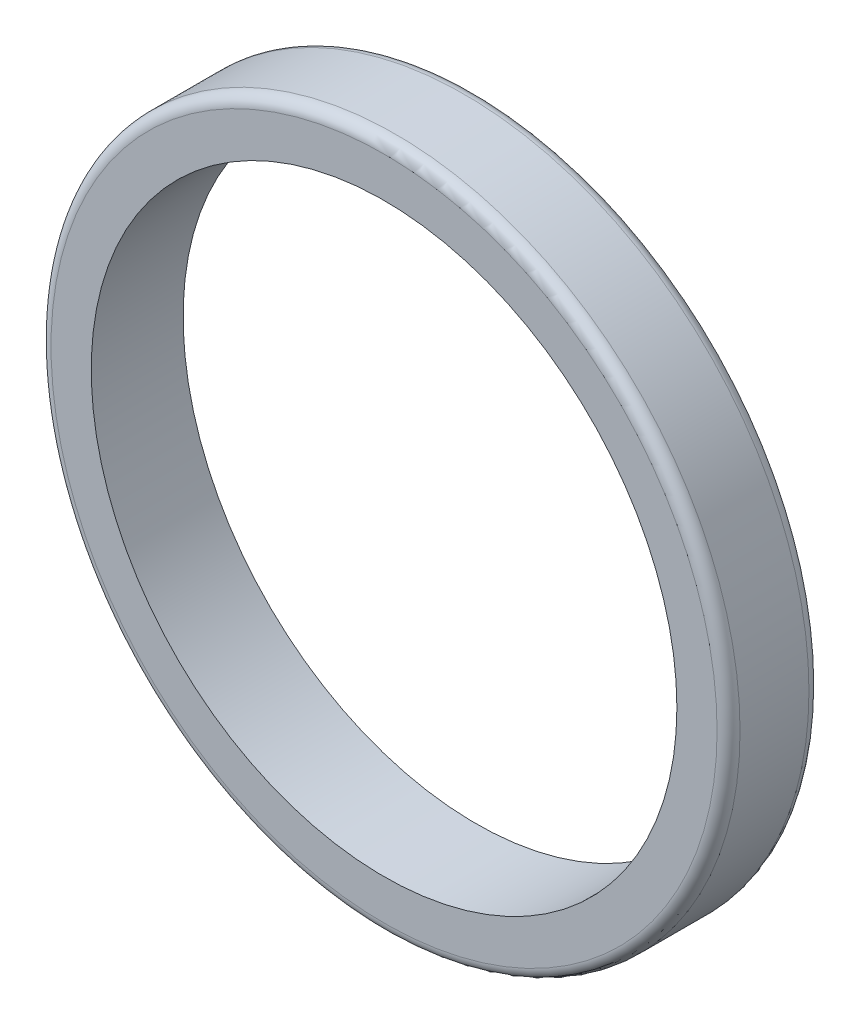
ISO-10303-21;
HEADER;
FILE_DESCRIPTION(('STEP AP214'),'2;1');
FILE_NAME('part.step','',(''),(''),'','','');
FILE_SCHEMA(('AUTOMOTIVE_DESIGN { 1 0 10303 214 1 1 1 1 }'));
ENDSEC;
DATA;
#1=APPLICATION_CONTEXT('core data for automotive mechanical design processes');
#2=APPLICATION_PROTOCOL_DEFINITION('international standard','automotive_design',2000,#1);
#3=PRODUCT_CONTEXT('',#1,'mechanical');
#4=PRODUCT('Part','Part','',(#3));
#5=PRODUCT_RELATED_PRODUCT_CATEGORY('part','',(#4));
#6=PRODUCT_DEFINITION_FORMATION('','',#4);
#7=PRODUCT_DEFINITION_CONTEXT('part definition',#1,'design');
#8=PRODUCT_DEFINITION('design','',#6,#7);
#9=PRODUCT_DEFINITION_SHAPE('','',#8);
#10=(LENGTH_UNIT() NAMED_UNIT(*) SI_UNIT(.MILLI.,.METRE.));
#11=(NAMED_UNIT(*) PLANE_ANGLE_UNIT() SI_UNIT($,.RADIAN.));
#12=(NAMED_UNIT(*) SI_UNIT($,.STERADIAN.) SOLID_ANGLE_UNIT());
#13=UNCERTAINTY_MEASURE_WITH_UNIT(LENGTH_MEASURE(1.E-05),#10,'distance_accuracy_value','');
#14=(GEOMETRIC_REPRESENTATION_CONTEXT(3) GLOBAL_UNCERTAINTY_ASSIGNED_CONTEXT((#13)) GLOBAL_UNIT_ASSIGNED_CONTEXT((#10,
#11,#12)) REPRESENTATION_CONTEXT('',''));
#15=CARTESIAN_POINT('',(0.,0.,0.));
#16=DIRECTION('',(0.,0.,1.));
#17=DIRECTION('',(1.,0.,0.));
#18=AXIS2_PLACEMENT_3D('',#15,#16,#17);
#19=CARTESIAN_POINT('',(0.,0.,8.));
#20=DIRECTION('',(0.,0.,-1.));
#21=DIRECTION('',(-1.,0.,0.));
#22=AXIS2_PLACEMENT_3D('',#19,#20,#21);
#23=CYLINDRICAL_SURFACE('',#22,30.);
#24=CARTESIAN_POINT('',(0.,0.,1.));
#25=DIRECTION('',(0.,0.,1.));
#26=DIRECTION('',(1.,0.,0.));
#27=AXIS2_PLACEMENT_3D('',#24,#25,#26);
#28=CIRCLE('',#27,30.);
#29=CARTESIAN_POINT('',(30.,0.,1.));
#30=VERTEX_POINT('',#29);
#31=EDGE_CURVE('E43',#30,#30,#28,.T.);
#32=ORIENTED_EDGE('',*,*,#31,.T.);
#33=EDGE_LOOP('',(#32));
#34=FACE_BOUND('',#33,.T.);
#35=CARTESIAN_POINT('',(0.,0.,7.));
#36=DIRECTION('',(0.,0.,1.));
#37=DIRECTION('',(1.,0.,0.));
#38=AXIS2_PLACEMENT_3D('',#35,#36,#37);
#39=CIRCLE('',#38,30.);
#40=CARTESIAN_POINT('',(30.,0.,7.));
#41=VERTEX_POINT('',#40);
#42=EDGE_CURVE('E47',#41,#41,#39,.F.);
#43=ORIENTED_EDGE('',*,*,#42,.T.);
#44=EDGE_LOOP('',(#43));
#45=FACE_BOUND('',#44,.T.);
#46=ADVANCED_FACE('F32',(#34,#45),#23,.T.);
#47=CARTESIAN_POINT('',(0.,0.,8.));
#48=DIRECTION('',(0.,0.,1.));
#49=DIRECTION('',(1.,0.,0.));
#50=AXIS2_PLACEMENT_3D('',#47,#48,#49);
#51=PLANE('',#50);
#52=CARTESIAN_POINT('',(0.,0.,8.));
#53=DIRECTION('',(0.,0.,1.));
#54=DIRECTION('',(1.,0.,0.));
#55=AXIS2_PLACEMENT_3D('',#52,#53,#54);
#56=CIRCLE('',#55,29.);
#57=CARTESIAN_POINT('',(29.,0.,8.));
#58=VERTEX_POINT('',#57);
#59=EDGE_CURVE('E10',#58,#58,#56,.T.);
#60=ORIENTED_EDGE('',*,*,#59,.T.);
#61=EDGE_LOOP('',(#60));
#62=FACE_BOUND('',#61,.T.);
#63=CARTESIAN_POINT('',(0.,0.,8.));
#64=DIRECTION('',(0.,0.,1.));
#65=DIRECTION('',(1.,0.,0.));
#66=AXIS2_PLACEMENT_3D('',#63,#64,#65);
#67=CIRCLE('',#66,25.5);
#68=CARTESIAN_POINT('',(25.5,0.,8.));
#69=VERTEX_POINT('',#68);
#70=EDGE_CURVE('E53',#69,#69,#67,.T.);
#71=ORIENTED_EDGE('',*,*,#70,.F.);
#72=EDGE_LOOP('',(#71));
#73=FACE_BOUND('',#72,.T.);
#74=ADVANCED_FACE('F68',(#62,#73),#51,.T.);
#75=CARTESIAN_POINT('',(0.,0.,0.));
#76=DIRECTION('',(0.,0.,1.));
#77=DIRECTION('',(1.,0.,0.));
#78=AXIS2_PLACEMENT_3D('',#75,#76,#77);
#79=PLANE('',#78);
#80=CARTESIAN_POINT('',(0.,0.,0.));
#81=DIRECTION('',(0.,0.,1.));
#82=DIRECTION('',(1.,0.,0.));
#83=AXIS2_PLACEMENT_3D('',#80,#81,#82);
#84=CIRCLE('',#83,29.);
#85=CARTESIAN_POINT('',(29.,0.,0.));
#86=VERTEX_POINT('',#85);
#87=EDGE_CURVE('E39',#86,#86,#84,.F.);
#88=ORIENTED_EDGE('',*,*,#87,.T.);
#89=EDGE_LOOP('',(#88));
#90=FACE_BOUND('',#89,.T.);
#91=CARTESIAN_POINT('',(0.,0.,0.));
#92=DIRECTION('',(0.,0.,1.));
#93=DIRECTION('',(1.,0.,0.));
#94=AXIS2_PLACEMENT_3D('',#91,#92,#93);
#95=CIRCLE('',#94,25.5);
#96=CARTESIAN_POINT('',(25.5,0.,0.));
#97=VERTEX_POINT('',#96);
#98=EDGE_CURVE('E52',#97,#97,#95,.T.);
#99=ORIENTED_EDGE('',*,*,#98,.T.);
#100=EDGE_LOOP('',(#99));
#101=FACE_BOUND('',#100,.T.);
#102=ADVANCED_FACE('F59',(#90,#101),#79,.F.);
#103=CARTESIAN_POINT('',(0.,0.,0.));
#104=DIRECTION('',(0.,0.,1.));
#105=DIRECTION('',(1.,0.,0.));
#106=AXIS2_PLACEMENT_3D('',#103,#104,#105);
#107=CYLINDRICAL_SURFACE('',#106,25.5);
#108=ORIENTED_EDGE('',*,*,#98,.F.);
#109=EDGE_LOOP('',(#108));
#110=FACE_BOUND('',#109,.T.);
#111=ORIENTED_EDGE('',*,*,#70,.T.);
#112=EDGE_LOOP('',(#111));
#113=FACE_BOUND('',#112,.T.);
#114=ADVANCED_FACE('F61',(#110,#113),#107,.F.);
#115=CARTESIAN_POINT('',(0.,0.,1.));
#116=DIRECTION('',(0.,0.,1.));
#117=DIRECTION('',(1.,0.,0.));
#118=AXIS2_PLACEMENT_3D('',#115,#116,#117);
#119=TOROIDAL_SURFACE('',#118,29.,1.);
#120=ORIENTED_EDGE('',*,*,#87,.F.);
#121=EDGE_LOOP('',(#120));
#122=FACE_BOUND('',#121,.T.);
#123=ORIENTED_EDGE('',*,*,#31,.F.);
#124=EDGE_LOOP('',(#123));
#125=FACE_BOUND('',#124,.T.);
#126=ADVANCED_FACE('F64',(#122,#125),#119,.T.);
#127=CARTESIAN_POINT('',(0.,0.,7.));
#128=DIRECTION('',(0.,0.,1.));
#129=DIRECTION('',(1.,0.,0.));
#130=AXIS2_PLACEMENT_3D('',#127,#128,#129);
#131=TOROIDAL_SURFACE('',#130,29.,1.);
#132=ORIENTED_EDGE('',*,*,#42,.F.);
#133=EDGE_LOOP('',(#132));
#134=FACE_BOUND('',#133,.T.);
#135=ORIENTED_EDGE('',*,*,#59,.F.);
#136=EDGE_LOOP('',(#135));
#137=FACE_BOUND('',#136,.T.);
#138=ADVANCED_FACE('F34',(#134,#137),#131,.T.);
#139=CLOSED_SHELL('',(#46,#74,#102,#114,#126,#138));
#140=MANIFOLD_SOLID_BREP('B2',#139);
#141=ADVANCED_BREP_SHAPE_REPRESENTATION('',(#18,#140),#14);
#142=SHAPE_DEFINITION_REPRESENTATION(#9,#141);
ENDSEC;
END-ISO-10303-21;
